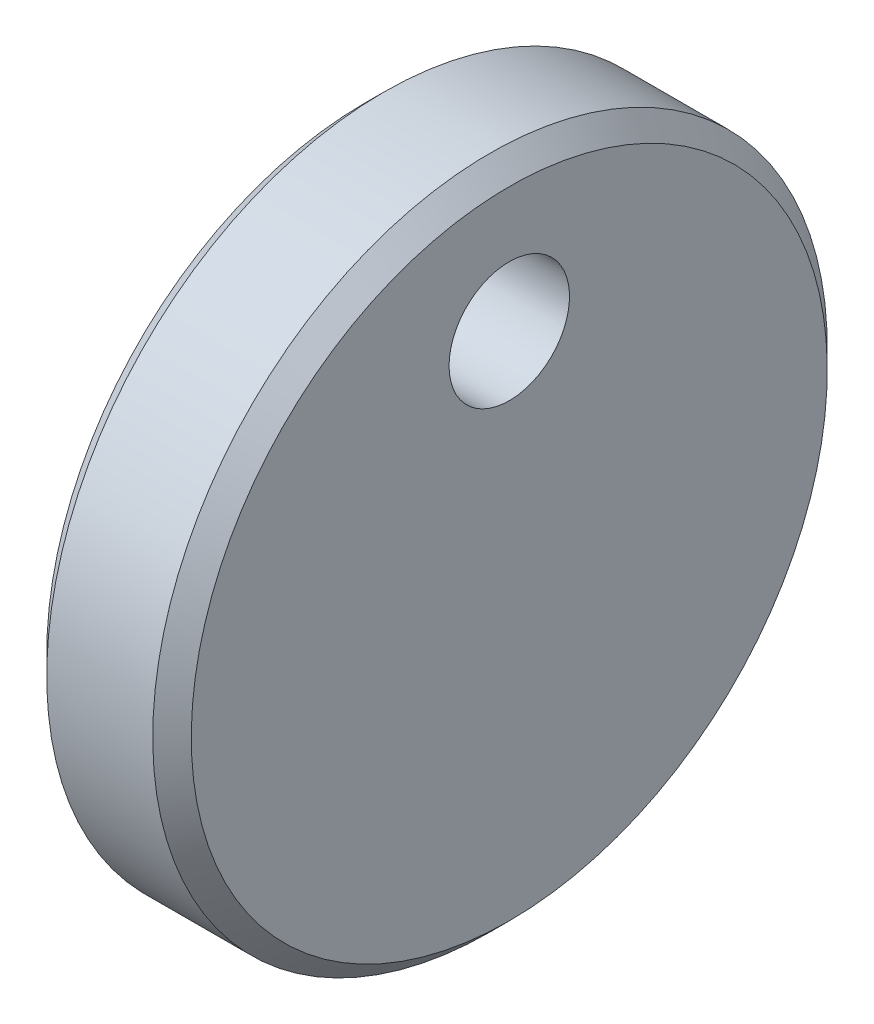
ISO-10303-21;
HEADER;
FILE_DESCRIPTION(('STEP AP214'),'2;1');
FILE_NAME('part.step','',(''),(''),'','','');
FILE_SCHEMA(('AUTOMOTIVE_DESIGN { 1 0 10303 214 1 1 1 1 }'));
ENDSEC;
DATA;
#1=APPLICATION_CONTEXT('core data for automotive mechanical design processes');
#2=APPLICATION_PROTOCOL_DEFINITION('international standard','automotive_design',2000,#1);
#3=PRODUCT_CONTEXT('',#1,'mechanical');
#4=PRODUCT('Part','Part','',(#3));
#5=PRODUCT_RELATED_PRODUCT_CATEGORY('part','',(#4));
#6=PRODUCT_DEFINITION_FORMATION('','',#4);
#7=PRODUCT_DEFINITION_CONTEXT('part definition',#1,'design');
#8=PRODUCT_DEFINITION('design','',#6,#7);
#9=PRODUCT_DEFINITION_SHAPE('','',#8);
#10=(LENGTH_UNIT() NAMED_UNIT(*) SI_UNIT(.MILLI.,.METRE.));
#11=(NAMED_UNIT(*) PLANE_ANGLE_UNIT() SI_UNIT($,.RADIAN.));
#12=(NAMED_UNIT(*) SI_UNIT($,.STERADIAN.) SOLID_ANGLE_UNIT());
#13=UNCERTAINTY_MEASURE_WITH_UNIT(LENGTH_MEASURE(1.E-05),#10,'distance_accuracy_value','');
#14=(GEOMETRIC_REPRESENTATION_CONTEXT(3) GLOBAL_UNCERTAINTY_ASSIGNED_CONTEXT((#13)) GLOBAL_UNIT_ASSIGNED_CONTEXT((#10,
#11,#12)) REPRESENTATION_CONTEXT('',''));
#15=CARTESIAN_POINT('',(0.,0.,0.));
#16=DIRECTION('',(0.,0.,1.));
#17=DIRECTION('',(1.,0.,0.));
#18=AXIS2_PLACEMENT_3D('',#15,#16,#17);
#19=CARTESIAN_POINT('',(0.,0.,0.));
#20=DIRECTION('',(-1.,0.,0.));
#21=DIRECTION('',(0.,-1.,0.));
#22=AXIS2_PLACEMENT_3D('',#19,#20,#21);
#23=PLANE('',#22);
#24=CARTESIAN_POINT('',(0.,0.,0.));
#25=DIRECTION('',(-1.,0.,0.));
#26=DIRECTION('',(0.,-1.,0.));
#27=AXIS2_PLACEMENT_3D('',#24,#25,#26);
#28=CIRCLE('',#27,6.6);
#29=CARTESIAN_POINT('',(0.,-6.6,0.));
#30=VERTEX_POINT('',#29);
#31=EDGE_CURVE('E43',#30,#30,#28,.F.);
#32=ORIENTED_EDGE('',*,*,#31,.T.);
#33=EDGE_LOOP('',(#32));
#34=FACE_BOUND('',#33,.T.);
#35=CARTESIAN_POINT('',(0.,4.,0.));
#36=DIRECTION('',(-1.,0.,0.));
#37=DIRECTION('',(0.,0.,1.));
#38=AXIS2_PLACEMENT_3D('',#35,#36,#37);
#39=CIRCLE('',#38,1.25);
#40=CARTESIAN_POINT('',(0.,4.,1.25));
#41=VERTEX_POINT('',#40);
#42=EDGE_CURVE('E56',#41,#41,#39,.T.);
#43=ORIENTED_EDGE('',*,*,#42,.T.);
#44=EDGE_LOOP('',(#43));
#45=FACE_BOUND('',#44,.T.);
#46=ADVANCED_FACE('F35',(#34,#45),#23,.F.);
#47=CARTESIAN_POINT('',(-3.,0.,0.));
#48=DIRECTION('',(-1.,0.,0.));
#49=DIRECTION('',(0.,-1.,0.));
#50=AXIS2_PLACEMENT_3D('',#47,#48,#49);
#51=CYLINDRICAL_SURFACE('',#50,7.);
#52=CARTESIAN_POINT('',(-0.399999999999999,0.,0.));
#53=DIRECTION('',(-1.,0.,0.));
#54=DIRECTION('',(0.,-1.,0.));
#55=AXIS2_PLACEMENT_3D('',#52,#53,#54);
#56=CIRCLE('',#55,7.);
#57=CARTESIAN_POINT('',(-0.399999999999998,-7.,0.));
#58=VERTEX_POINT('',#57);
#59=EDGE_CURVE('E47',#58,#58,#56,.T.);
#60=ORIENTED_EDGE('',*,*,#59,.T.);
#61=EDGE_LOOP('',(#60));
#62=FACE_BOUND('',#61,.T.);
#63=CARTESIAN_POINT('',(-2.6,0.,0.));
#64=DIRECTION('',(1.,0.,0.));
#65=DIRECTION('',(0.,1.,0.));
#66=AXIS2_PLACEMENT_3D('',#63,#64,#65);
#67=CIRCLE('',#66,7.);
#68=CARTESIAN_POINT('',(-2.6,7.,0.));
#69=VERTEX_POINT('',#68);
#70=EDGE_CURVE('E51',#69,#69,#67,.T.);
#71=ORIENTED_EDGE('',*,*,#70,.T.);
#72=EDGE_LOOP('',(#71));
#73=FACE_BOUND('',#72,.T.);
#74=ADVANCED_FACE('F73',(#62,#73),#51,.T.);
#75=CARTESIAN_POINT('',(-3.,7.,0.));
#76=DIRECTION('',(1.,0.,0.));
#77=DIRECTION('',(0.,1.,0.));
#78=AXIS2_PLACEMENT_3D('',#75,#76,#77);
#79=PLANE('',#78);
#80=CARTESIAN_POINT('',(-3.,0.,0.));
#81=DIRECTION('',(1.,0.,0.));
#82=DIRECTION('',(0.,1.,0.));
#83=AXIS2_PLACEMENT_3D('',#80,#81,#82);
#84=CIRCLE('',#83,6.6);
#85=CARTESIAN_POINT('',(-3.,6.6,0.));
#86=VERTEX_POINT('',#85);
#87=EDGE_CURVE('E10',#86,#86,#84,.F.);
#88=ORIENTED_EDGE('',*,*,#87,.T.);
#89=EDGE_LOOP('',(#88));
#90=FACE_BOUND('',#89,.T.);
#91=CARTESIAN_POINT('',(-3.,4.,0.));
#92=DIRECTION('',(-1.,0.,0.));
#93=DIRECTION('',(0.,0.,1.));
#94=AXIS2_PLACEMENT_3D('',#91,#92,#93);
#95=CIRCLE('',#94,1.25);
#96=CARTESIAN_POINT('',(-3.,4.,1.25));
#97=VERTEX_POINT('',#96);
#98=EDGE_CURVE('E57',#97,#97,#95,.T.);
#99=ORIENTED_EDGE('',*,*,#98,.F.);
#100=EDGE_LOOP('',(#99));
#101=FACE_BOUND('',#100,.T.);
#102=ADVANCED_FACE('F68',(#90,#101),#79,.F.);
#103=CARTESIAN_POINT('',(0.,4.,0.));
#104=DIRECTION('',(-1.,0.,0.));
#105=DIRECTION('',(0.,0.,1.));
#106=AXIS2_PLACEMENT_3D('',#103,#104,#105);
#107=CYLINDRICAL_SURFACE('',#106,1.25);
#108=CARTESIAN_POINT('',(0.,4.,1.25));
#109=CARTESIAN_POINT('',(-0.0312499999999982,4.,1.25));
#110=CARTESIAN_POINT('',(-0.0624999999999983,4.,1.25));
#111=CARTESIAN_POINT('',(-0.124999999999998,4.,1.25));
#112=CARTESIAN_POINT('',(-0.156249999999998,4.,1.25));
#113=CARTESIAN_POINT('',(-0.218749999999998,4.,1.25));
#114=CARTESIAN_POINT('',(-0.249999999999998,4.,1.25));
#115=CARTESIAN_POINT('',(-0.312499999999998,4.,1.25));
#116=CARTESIAN_POINT('',(-0.343749999999998,4.,1.25));
#117=CARTESIAN_POINT('',(-0.406249999999998,4.,1.25));
#118=CARTESIAN_POINT('',(-0.437499999999998,4.,1.25));
#119=CARTESIAN_POINT('',(-0.499999999999998,4.,1.25));
#120=CARTESIAN_POINT('',(-0.531249999999998,4.,1.25));
#121=CARTESIAN_POINT('',(-0.593749999999998,4.,1.25));
#122=CARTESIAN_POINT('',(-0.624999999999998,4.,1.25));
#123=CARTESIAN_POINT('',(-0.687499999999998,4.,1.25));
#124=CARTESIAN_POINT('',(-0.718749999999998,4.,1.25));
#125=CARTESIAN_POINT('',(-0.781249999999998,4.,1.25));
#126=CARTESIAN_POINT('',(-0.812499999999998,4.,1.25));
#127=CARTESIAN_POINT('',(-0.874999999999998,4.,1.25));
#128=CARTESIAN_POINT('',(-0.906249999999998,4.,1.25));
#129=CARTESIAN_POINT('',(-0.968749999999998,4.,1.25));
#130=CARTESIAN_POINT('',(-0.999999999999998,4.,1.25));
#131=CARTESIAN_POINT('',(-1.0625,4.,1.25));
#132=CARTESIAN_POINT('',(-1.09375,4.,1.25));
#133=CARTESIAN_POINT('',(-1.15625,4.,1.25));
#134=CARTESIAN_POINT('',(-1.1875,4.,1.25));
#135=CARTESIAN_POINT('',(-1.25,4.,1.25));
#136=CARTESIAN_POINT('',(-1.28125,4.,1.25));
#137=CARTESIAN_POINT('',(-1.34375,4.,1.25));
#138=CARTESIAN_POINT('',(-1.375,4.,1.25));
#139=CARTESIAN_POINT('',(-1.4375,4.,1.25));
#140=CARTESIAN_POINT('',(-1.46875,4.,1.25));
#141=CARTESIAN_POINT('',(-1.53125,4.,1.25));
#142=CARTESIAN_POINT('',(-1.5625,4.,1.25));
#143=CARTESIAN_POINT('',(-1.625,4.,1.25));
#144=CARTESIAN_POINT('',(-1.65625,4.,1.25));
#145=CARTESIAN_POINT('',(-1.71875,4.,1.25));
#146=CARTESIAN_POINT('',(-1.75,4.,1.25));
#147=CARTESIAN_POINT('',(-1.8125,4.,1.25));
#148=CARTESIAN_POINT('',(-1.84375,4.,1.25));
#149=CARTESIAN_POINT('',(-1.90625,4.,1.25));
#150=CARTESIAN_POINT('',(-1.9375,4.,1.25));
#151=CARTESIAN_POINT('',(-2.,4.,1.25));
#152=CARTESIAN_POINT('',(-2.03125,4.,1.25));
#153=CARTESIAN_POINT('',(-2.09375,4.,1.25));
#154=CARTESIAN_POINT('',(-2.125,4.,1.25));
#155=CARTESIAN_POINT('',(-2.1875,4.,1.25));
#156=CARTESIAN_POINT('',(-2.21875,4.,1.25));
#157=CARTESIAN_POINT('',(-2.28125,4.,1.25));
#158=CARTESIAN_POINT('',(-2.3125,4.,1.25));
#159=CARTESIAN_POINT('',(-2.375,4.,1.25));
#160=CARTESIAN_POINT('',(-2.40625,4.,1.25));
#161=CARTESIAN_POINT('',(-2.46875,4.,1.25));
#162=CARTESIAN_POINT('',(-2.5,4.,1.25));
#163=CARTESIAN_POINT('',(-2.5625,4.,1.25));
#164=CARTESIAN_POINT('',(-2.59375,4.,1.25));
#165=CARTESIAN_POINT('',(-2.65625,4.,1.25));
#166=CARTESIAN_POINT('',(-2.6875,4.,1.25));
#167=CARTESIAN_POINT('',(-2.75,4.,1.25));
#168=CARTESIAN_POINT('',(-2.78125,4.,1.25));
#169=CARTESIAN_POINT('',(-2.84375,4.,1.25));
#170=CARTESIAN_POINT('',(-2.875,4.,1.25));
#171=CARTESIAN_POINT('',(-2.9375,4.,1.25));
#172=CARTESIAN_POINT('',(-2.96875,4.,1.25));
#173=CARTESIAN_POINT('',(-3.,4.,1.25));
#174=B_SPLINE_CURVE_WITH_KNOTS('',3,(#108,#109,#110,#111,#112,#113,#114,#115,#116,#117,#118,
#119,#120,#121,#122,#123,#124,#125,#126,#127,#128,#129,#130,#131,#132,#133,#134,#135,#136,#137,
#138,#139,#140,#141,#142,#143,#144,#145,#146,#147,#148,#149,#150,#151,#152,#153,#154,#155,#156,
#157,#158,#159,#160,#161,#162,#163,#164,#165,#166,#167,#168,#169,#170,#171,#172,#173),
.UNSPECIFIED.,.F.,.F.,(4,2,2,2,2,2,2,2,2,2,2,2,2,2,2,2,2,2,2,2,2,2,2,2,2,2,2,2,2,2,2,2,4),(0.,
0.09375,0.1875,0.28125,0.375,0.46875,0.5625,0.65625,0.75,0.84375,0.9375,1.03125,1.125,1.21875,
1.3125,1.40625,1.5,1.59375,1.6875,1.78125,1.875,1.96875,2.0625,2.15625,2.25,2.34375,2.4375,
2.53125,2.625,2.71875,2.8125,2.90625,3.),.UNSPECIFIED.);
#175=EDGE_CURVE('BSEAM64',#41,#97,#174,.T.);
#176=ORIENTED_EDGE('',*,*,#42,.F.);
#177=ORIENTED_EDGE('',*,*,#98,.T.);
#178=ORIENTED_EDGE('',*,*,#175,.T.);
#179=ORIENTED_EDGE('',*,*,#175,.F.);
#180=EDGE_LOOP('',(#176,#178,#177,#179));
#181=FACE_BOUND('',#180,.T.);
#182=ADVANCED_FACE('F64',(#181),#107,.F.);
#183=CARTESIAN_POINT('',(-0.399999999999999,0.,0.));
#184=DIRECTION('',(-1.,0.,0.));
#185=DIRECTION('',(0.,-1.,0.));
#186=AXIS2_PLACEMENT_3D('',#183,#184,#185);
#187=CONICAL_SURFACE('',#186,7.,0.78539816339745);
#188=CARTESIAN_POINT('',(0.,-6.6,0.));
#189=CARTESIAN_POINT('',(-0.00416666666666526,-6.60416666666667,0.));
#190=CARTESIAN_POINT('',(-0.00833333333333199,-6.60833333333333,0.));
#191=CARTESIAN_POINT('',(-0.0166666666666654,-6.61666666666667,0.));
#192=CARTESIAN_POINT('',(-0.0208333333333322,-6.62083333333333,0.));
#193=CARTESIAN_POINT('',(-0.0291666666666655,-6.62916666666667,0.));
#194=CARTESIAN_POINT('',(-0.0333333333333321,-6.63333333333333,0.));
#195=CARTESIAN_POINT('',(-0.0416666666666654,-6.64166666666667,0.));
#196=CARTESIAN_POINT('',(-0.045833333333332,-6.64583333333333,0.));
#197=CARTESIAN_POINT('',(-0.0541666666666653,-6.65416666666667,0.));
#198=CARTESIAN_POINT('',(-0.0583333333333321,-6.65833333333333,0.));
#199=CARTESIAN_POINT('',(-0.0666666666666654,-6.66666666666667,0.));
#200=CARTESIAN_POINT('',(-0.070833333333332,-6.67083333333333,0.));
#201=CARTESIAN_POINT('',(-0.0791666666666653,-6.67916666666667,0.));
#202=CARTESIAN_POINT('',(-0.083333333333332,-6.68333333333333,0.));
#203=CARTESIAN_POINT('',(-0.0916666666666654,-6.69166666666667,0.));
#204=CARTESIAN_POINT('',(-0.095833333333332,-6.69583333333333,0.));
#205=CARTESIAN_POINT('',(-0.104166666666665,-6.70416666666667,0.));
#206=CARTESIAN_POINT('',(-0.108333333333332,-6.70833333333333,0.));
#207=CARTESIAN_POINT('',(-0.116666666666665,-6.71666666666667,0.));
#208=CARTESIAN_POINT('',(-0.120833333333332,-6.72083333333333,0.));
#209=CARTESIAN_POINT('',(-0.129166666666665,-6.72916666666667,0.));
#210=CARTESIAN_POINT('',(-0.133333333333332,-6.73333333333333,0.));
#211=CARTESIAN_POINT('',(-0.141666666666665,-6.74166666666667,0.));
#212=CARTESIAN_POINT('',(-0.145833333333332,-6.74583333333333,0.));
#213=CARTESIAN_POINT('',(-0.154166666666665,-6.75416666666667,0.));
#214=CARTESIAN_POINT('',(-0.158333333333332,-6.75833333333333,0.));
#215=CARTESIAN_POINT('',(-0.166666666666665,-6.76666666666667,0.));
#216=CARTESIAN_POINT('',(-0.170833333333332,-6.77083333333333,0.));
#217=CARTESIAN_POINT('',(-0.179166666666665,-6.77916666666667,0.));
#218=CARTESIAN_POINT('',(-0.183333333333332,-6.78333333333333,0.));
#219=CARTESIAN_POINT('',(-0.191666666666665,-6.79166666666667,0.));
#220=CARTESIAN_POINT('',(-0.195833333333332,-6.79583333333333,0.));
#221=CARTESIAN_POINT('',(-0.204166666666665,-6.80416666666667,0.));
#222=CARTESIAN_POINT('',(-0.208333333333332,-6.80833333333333,0.));
#223=CARTESIAN_POINT('',(-0.216666666666665,-6.81666666666667,0.));
#224=CARTESIAN_POINT('',(-0.220833333333332,-6.82083333333333,0.));
#225=CARTESIAN_POINT('',(-0.229166666666665,-6.82916666666667,0.));
#226=CARTESIAN_POINT('',(-0.233333333333332,-6.83333333333333,0.));
#227=CARTESIAN_POINT('',(-0.241666666666665,-6.84166666666667,0.));
#228=CARTESIAN_POINT('',(-0.245833333333332,-6.84583333333333,0.));
#229=CARTESIAN_POINT('',(-0.254166666666665,-6.85416666666667,0.));
#230=CARTESIAN_POINT('',(-0.258333333333332,-6.85833333333333,0.));
#231=CARTESIAN_POINT('',(-0.266666666666665,-6.86666666666667,0.));
#232=CARTESIAN_POINT('',(-0.270833333333332,-6.87083333333333,0.));
#233=CARTESIAN_POINT('',(-0.279166666666665,-6.87916666666667,0.));
#234=CARTESIAN_POINT('',(-0.283333333333332,-6.88333333333333,0.));
#235=CARTESIAN_POINT('',(-0.291666666666665,-6.89166666666667,0.));
#236=CARTESIAN_POINT('',(-0.295833333333332,-6.89583333333333,0.));
#237=CARTESIAN_POINT('',(-0.304166666666665,-6.90416666666667,0.));
#238=CARTESIAN_POINT('',(-0.308333333333331,-6.90833333333333,0.));
#239=CARTESIAN_POINT('',(-0.316666666666665,-6.91666666666667,0.));
#240=CARTESIAN_POINT('',(-0.320833333333332,-6.92083333333333,0.));
#241=CARTESIAN_POINT('',(-0.329166666666665,-6.92916666666667,0.));
#242=CARTESIAN_POINT('',(-0.333333333333332,-6.93333333333333,0.));
#243=CARTESIAN_POINT('',(-0.341666666666665,-6.94166666666667,0.));
#244=CARTESIAN_POINT('',(-0.345833333333331,-6.94583333333333,0.));
#245=CARTESIAN_POINT('',(-0.354166666666665,-6.95416666666667,0.));
#246=CARTESIAN_POINT('',(-0.358333333333332,-6.95833333333333,0.));
#247=CARTESIAN_POINT('',(-0.366666666666665,-6.96666666666667,0.));
#248=CARTESIAN_POINT('',(-0.370833333333331,-6.97083333333333,0.));
#249=CARTESIAN_POINT('',(-0.379166666666665,-6.97916666666667,0.));
#250=CARTESIAN_POINT('',(-0.383333333333331,-6.98333333333333,0.));
#251=CARTESIAN_POINT('',(-0.391666666666665,-6.99166666666667,0.));
#252=CARTESIAN_POINT('',(-0.395833333333332,-6.99583333333333,0.));
#253=CARTESIAN_POINT('',(-0.399999999999998,-7.,0.));
#254=B_SPLINE_CURVE_WITH_KNOTS('',3,(#188,#189,#190,#191,#192,#193,#194,#195,#196,#197,#198,
#199,#200,#201,#202,#203,#204,#205,#206,#207,#208,#209,#210,#211,#212,#213,#214,#215,#216,#217,
#218,#219,#220,#221,#222,#223,#224,#225,#226,#227,#228,#229,#230,#231,#232,#233,#234,#235,#236,
#237,#238,#239,#240,#241,#242,#243,#244,#245,#246,#247,#248,#249,#250,#251,#252,#253),
.UNSPECIFIED.,.F.,.F.,(4,2,2,2,2,2,2,2,2,2,2,2,2,2,2,2,2,2,2,2,2,2,2,2,2,2,2,2,2,2,2,2,4),(0.,
0.0176776695296639,0.0353553390593272,0.0530330085889912,0.0707106781186551,0.0883883476483184,
0.106066017177982,0.123743686707646,0.14142135623731,0.159099025766973,0.176776695296637,
0.194454364826301,0.212132034355965,0.229809703885628,0.247487373415292,0.265165042944955,
0.282842712474619,0.300520382004283,0.318198051533946,0.33587572106361,0.353553390593274,
0.371231060122937,0.388908729652601,0.406586399182265,0.424264068711929,0.441941738241593,
0.459619407771256,0.47729707730092,0.494974746830584,0.512652416360247,0.530330085889911,
0.548007755419574,0.565685424949238),.UNSPECIFIED.);
#255=EDGE_CURVE('BSEAM67',#30,#58,#254,.T.);
#256=ORIENTED_EDGE('',*,*,#31,.F.);
#257=ORIENTED_EDGE('',*,*,#59,.F.);
#258=ORIENTED_EDGE('',*,*,#255,.T.);
#259=ORIENTED_EDGE('',*,*,#255,.F.);
#260=EDGE_LOOP('',(#256,#258,#257,#259));
#261=FACE_BOUND('',#260,.T.);
#262=ADVANCED_FACE('F67',(#261),#187,.T.);
#263=CARTESIAN_POINT('',(-3.,0.,0.));
#264=DIRECTION('',(1.,0.,0.));
#265=DIRECTION('',(0.,1.,0.));
#266=AXIS2_PLACEMENT_3D('',#263,#264,#265);
#267=CONICAL_SURFACE('',#266,6.6,0.785398163397449);
#268=ORIENTED_EDGE('',*,*,#70,.F.);
#269=EDGE_LOOP('',(#268));
#270=FACE_BOUND('',#269,.T.);
#271=ORIENTED_EDGE('',*,*,#87,.F.);
#272=EDGE_LOOP('',(#271));
#273=FACE_BOUND('',#272,.T.);
#274=ADVANCED_FACE('F38',(#270,#273),#267,.T.);
#275=CLOSED_SHELL('',(#46,#74,#102,#182,#262,#274));
#276=MANIFOLD_SOLID_BREP('B2',#275);
#277=ADVANCED_BREP_SHAPE_REPRESENTATION('',(#18,#276),#14);
#278=SHAPE_DEFINITION_REPRESENTATION(#9,#277);
ENDSEC;
END-ISO-10303-21;
